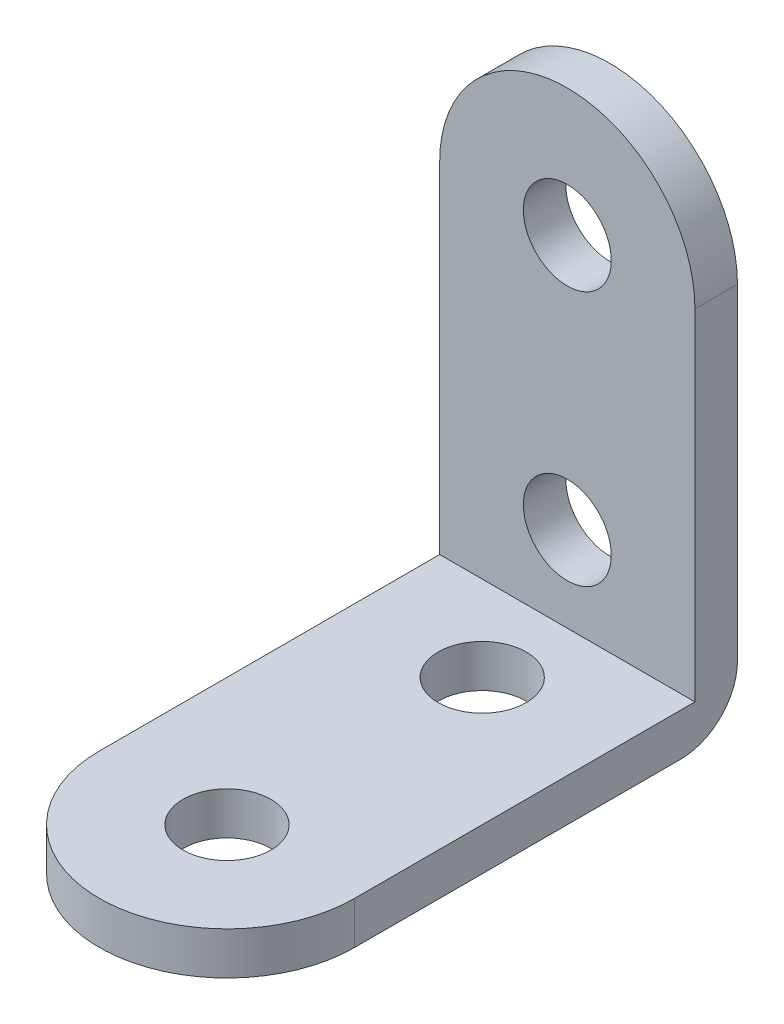
ISO-10303-21;
HEADER;
FILE_DESCRIPTION(('STEP AP214'),'2;1');
FILE_NAME('part.step','',(''),(''),'','','');
FILE_SCHEMA(('AUTOMOTIVE_DESIGN { 1 0 10303 214 1 1 1 1 }'));
ENDSEC;
DATA;
#1=APPLICATION_CONTEXT('core data for automotive mechanical design processes');
#2=APPLICATION_PROTOCOL_DEFINITION('international standard','automotive_design',2000,#1);
#3=PRODUCT_CONTEXT('',#1,'mechanical');
#4=PRODUCT('Part','Part','',(#3));
#5=PRODUCT_RELATED_PRODUCT_CATEGORY('part','',(#4));
#6=PRODUCT_DEFINITION_FORMATION('','',#4);
#7=PRODUCT_DEFINITION_CONTEXT('part definition',#1,'design');
#8=PRODUCT_DEFINITION('design','',#6,#7);
#9=PRODUCT_DEFINITION_SHAPE('','',#8);
#10=(LENGTH_UNIT() NAMED_UNIT(*) SI_UNIT(.MILLI.,.METRE.));
#11=(NAMED_UNIT(*) PLANE_ANGLE_UNIT() SI_UNIT($,.RADIAN.));
#12=(NAMED_UNIT(*) SI_UNIT($,.STERADIAN.) SOLID_ANGLE_UNIT());
#13=UNCERTAINTY_MEASURE_WITH_UNIT(LENGTH_MEASURE(1.E-05),#10,'distance_accuracy_value','');
#14=(GEOMETRIC_REPRESENTATION_CONTEXT(3) GLOBAL_UNCERTAINTY_ASSIGNED_CONTEXT((#13)) GLOBAL_UNIT_ASSIGNED_CONTEXT((#10,
#11,#12)) REPRESENTATION_CONTEXT('',''));
#15=CARTESIAN_POINT('',(0.,0.,0.));
#16=DIRECTION('',(0.,0.,1.));
#17=DIRECTION('',(1.,0.,0.));
#18=AXIS2_PLACEMENT_3D('',#15,#16,#17);
#19=CARTESIAN_POINT('',(0.,2.,-11.5));
#20=DIRECTION('',(-1.,0.,0.));
#21=DIRECTION('',(0.,0.,1.));
#22=AXIS2_PLACEMENT_3D('',#19,#20,#21);
#23=CYLINDRICAL_SURFACE('',#22,2.);
#24=DIRECTION('',(1.,0.,0.));
#25=VECTOR('',#24,1.);
#26=CARTESIAN_POINT('',(0.,0.,-11.5));
#27=LINE('',#26,#25);
#28=CARTESIAN_POINT('',(-4.5,0.,-11.5));
#29=VERTEX_POINT('',#28);
#30=CARTESIAN_POINT('',(4.5,0.,-11.5));
#31=VERTEX_POINT('',#30);
#32=EDGE_CURVE('E164',#29,#31,#27,.T.);
#33=ORIENTED_EDGE('',*,*,#32,.F.);
#34=CARTESIAN_POINT('',(-4.5,2.,-11.5));
#35=DIRECTION('',(-1.,0.,0.));
#36=DIRECTION('',(0.,0.,1.));
#37=AXIS2_PLACEMENT_3D('',#34,#35,#36);
#38=CIRCLE('',#37,2.);
#39=CARTESIAN_POINT('',(-4.5,2.,-13.5));
#40=VERTEX_POINT('',#39);
#41=EDGE_CURVE('E42',#40,#29,#38,.T.);
#42=ORIENTED_EDGE('',*,*,#41,.F.);
#43=DIRECTION('',(1.,0.,0.));
#44=VECTOR('',#43,1.);
#45=CARTESIAN_POINT('',(0.,2.,-13.5));
#46=LINE('',#45,#44);
#47=CARTESIAN_POINT('',(4.5,2.,-13.5));
#48=VERTEX_POINT('',#47);
#49=EDGE_CURVE('E167',#48,#40,#46,.F.);
#50=ORIENTED_EDGE('',*,*,#49,.F.);
#51=CARTESIAN_POINT('',(4.5,2.,-11.5));
#52=DIRECTION('',(-1.,0.,0.));
#53=DIRECTION('',(0.,0.,1.));
#54=AXIS2_PLACEMENT_3D('',#51,#52,#53);
#55=CIRCLE('',#54,2.);
#56=EDGE_CURVE('E11',#31,#48,#55,.F.);
#57=ORIENTED_EDGE('',*,*,#56,.F.);
#58=EDGE_LOOP('',(#33,#42,#50,#57));
#59=FACE_BOUND('',#58,.T.);
#60=ADVANCED_FACE('F35',(#59),#23,.T.);
#61=CARTESIAN_POINT('',(0.,1.5,-13.5));
#62=DIRECTION('',(0.,0.,-1.));
#63=DIRECTION('',(-1.,0.,0.));
#64=AXIS2_PLACEMENT_3D('',#61,#62,#63);
#65=PLANE('',#64);
#66=CARTESIAN_POINT('',(0.,13.5,-13.5));
#67=DIRECTION('',(0.,0.,-1.));
#68=DIRECTION('',(0.,1.,0.));
#69=AXIS2_PLACEMENT_3D('',#66,#67,#68);
#70=CIRCLE('',#69,1.55);
#71=CARTESIAN_POINT('',(0.,15.05,-13.5));
#72=VERTEX_POINT('',#71);
#73=EDGE_CURVE('E123',#72,#72,#70,.T.);
#74=ORIENTED_EDGE('',*,*,#73,.F.);
#75=EDGE_LOOP('',(#74));
#76=FACE_BOUND('',#75,.T.);
#77=DIRECTION('',(0.,-1.,0.));
#78=VECTOR('',#77,1.);
#79=CARTESIAN_POINT('',(4.5,1.5,-13.5));
#80=LINE('',#79,#78);
#81=CARTESIAN_POINT('',(4.5,13.5,-13.5));
#82=VERTEX_POINT('',#81);
#83=EDGE_CURVE('E96',#82,#48,#80,.T.);
#84=ORIENTED_EDGE('',*,*,#83,.T.);
#85=ORIENTED_EDGE('',*,*,#49,.T.);
#86=DIRECTION('',(0.,-1.,0.));
#87=VECTOR('',#86,1.);
#88=CARTESIAN_POINT('',(-4.5,1.5,-13.5));
#89=LINE('',#88,#87);
#90=CARTESIAN_POINT('',(-4.5,13.5,-13.5));
#91=VERTEX_POINT('',#90);
#92=EDGE_CURVE('E147',#91,#40,#89,.T.);
#93=ORIENTED_EDGE('',*,*,#92,.F.);
#94=CARTESIAN_POINT('',(0.,13.5,-13.5));
#95=DIRECTION('',(0.,0.,-1.));
#96=DIRECTION('',(0.,1.,0.));
#97=AXIS2_PLACEMENT_3D('',#94,#95,#96);
#98=CIRCLE('',#97,4.5);
#99=EDGE_CURVE('E121',#91,#82,#98,.T.);
#100=ORIENTED_EDGE('',*,*,#99,.T.);
#101=EDGE_LOOP('',(#84,#85,#93,#100));
#102=FACE_BOUND('',#101,.T.);
#103=CARTESIAN_POINT('',(0.,4.5,-13.5));
#104=DIRECTION('',(0.,0.,-1.));
#105=DIRECTION('',(0.,1.,0.));
#106=AXIS2_PLACEMENT_3D('',#103,#104,#105);
#107=CIRCLE('',#106,1.55);
#108=CARTESIAN_POINT('',(0.,6.05,-13.5));
#109=VERTEX_POINT('',#108);
#110=EDGE_CURVE('E124',#109,#109,#107,.T.);
#111=ORIENTED_EDGE('',*,*,#110,.F.);
#112=EDGE_LOOP('',(#111));
#113=FACE_BOUND('',#112,.T.);
#114=ADVANCED_FACE('F194',(#76,#102,#113),#65,.T.);
#115=CARTESIAN_POINT('',(0.,13.5,-12.));
#116=DIRECTION('',(0.,0.,1.));
#117=DIRECTION('',(0.,1.,0.));
#118=AXIS2_PLACEMENT_3D('',#115,#116,#117);
#119=PLANE('',#118);
#120=CARTESIAN_POINT('',(0.,13.5,-12.));
#121=DIRECTION('',(0.,0.,-1.));
#122=DIRECTION('',(0.,1.,0.));
#123=AXIS2_PLACEMENT_3D('',#120,#121,#122);
#124=CIRCLE('',#123,1.55);
#125=CARTESIAN_POINT('',(0.,15.05,-12.));
#126=VERTEX_POINT('',#125);
#127=EDGE_CURVE('E115',#126,#126,#124,.T.);
#128=ORIENTED_EDGE('',*,*,#127,.T.);
#129=EDGE_LOOP('',(#128));
#130=FACE_BOUND('',#129,.T.);
#131=DIRECTION('',(0.,-1.,0.));
#132=VECTOR('',#131,1.);
#133=CARTESIAN_POINT('',(-4.5,13.5,-12.));
#134=LINE('',#133,#132);
#135=CARTESIAN_POINT('',(-4.5,13.5,-12.));
#136=VERTEX_POINT('',#135);
#137=CARTESIAN_POINT('',(-4.5,1.5,-12.));
#138=VERTEX_POINT('',#137);
#139=EDGE_CURVE('E110',#136,#138,#134,.T.);
#140=ORIENTED_EDGE('',*,*,#139,.T.);
#141=DIRECTION('',(1.,0.,0.));
#142=VECTOR('',#141,1.);
#143=CARTESIAN_POINT('',(0.,1.5,-12.));
#144=LINE('',#143,#142);
#145=CARTESIAN_POINT('',(4.5,1.5,-12.));
#146=VERTEX_POINT('',#145);
#147=EDGE_CURVE('E101',#138,#146,#144,.T.);
#148=ORIENTED_EDGE('',*,*,#147,.T.);
#149=DIRECTION('',(0.,-1.,0.));
#150=VECTOR('',#149,1.);
#151=CARTESIAN_POINT('',(4.5,13.5,-12.));
#152=LINE('',#151,#150);
#153=CARTESIAN_POINT('',(4.5,13.5,-12.));
#154=VERTEX_POINT('',#153);
#155=EDGE_CURVE('E93',#154,#146,#152,.T.);
#156=ORIENTED_EDGE('',*,*,#155,.F.);
#157=CARTESIAN_POINT('',(0.,13.5,-12.));
#158=DIRECTION('',(0.,0.,-1.));
#159=DIRECTION('',(0.,1.,0.));
#160=AXIS2_PLACEMENT_3D('',#157,#158,#159);
#161=CIRCLE('',#160,4.5);
#162=EDGE_CURVE('E108',#136,#154,#161,.T.);
#163=ORIENTED_EDGE('',*,*,#162,.F.);
#164=EDGE_LOOP('',(#140,#148,#156,#163));
#165=FACE_BOUND('',#164,.T.);
#166=CARTESIAN_POINT('',(0.,4.5,-12.));
#167=DIRECTION('',(0.,0.,-1.));
#168=DIRECTION('',(0.,1.,0.));
#169=AXIS2_PLACEMENT_3D('',#166,#167,#168);
#170=CIRCLE('',#169,1.55);
#171=CARTESIAN_POINT('',(0.,6.05,-12.));
#172=VERTEX_POINT('',#171);
#173=EDGE_CURVE('E185',#172,#172,#170,.T.);
#174=ORIENTED_EDGE('',*,*,#173,.T.);
#175=EDGE_LOOP('',(#174));
#176=FACE_BOUND('',#175,.T.);
#177=ADVANCED_FACE('F106',(#130,#165,#176),#119,.T.);
#178=CARTESIAN_POINT('',(-4.5,1.5,0.));
#179=DIRECTION('',(-1.,0.,0.));
#180=DIRECTION('',(0.,0.,1.));
#181=AXIS2_PLACEMENT_3D('',#178,#179,#180);
#182=PLANE('',#181);
#183=ORIENTED_EDGE('',*,*,#92,.T.);
#184=ORIENTED_EDGE('',*,*,#41,.T.);
#185=DIRECTION('',(0.,0.,-1.));
#186=VECTOR('',#185,1.);
#187=CARTESIAN_POINT('',(-4.5,0.,0.));
#188=LINE('',#187,#186);
#189=CARTESIAN_POINT('',(-4.5,0.,0.));
#190=VERTEX_POINT('',#189);
#191=EDGE_CURVE('E133',#190,#29,#188,.T.);
#192=ORIENTED_EDGE('',*,*,#191,.F.);
#193=DIRECTION('',(0.,-1.,0.));
#194=VECTOR('',#193,1.);
#195=CARTESIAN_POINT('',(-4.5,1.5,0.));
#196=LINE('',#195,#194);
#197=CARTESIAN_POINT('',(-4.5,1.5,0.));
#198=VERTEX_POINT('',#197);
#199=EDGE_CURVE('E162',#198,#190,#196,.T.);
#200=ORIENTED_EDGE('',*,*,#199,.F.);
#201=DIRECTION('',(0.,0.,-1.));
#202=VECTOR('',#201,1.);
#203=CARTESIAN_POINT('',(-4.5,1.5,0.));
#204=LINE('',#203,#202);
#205=EDGE_CURVE('E136',#198,#138,#204,.T.);
#206=ORIENTED_EDGE('',*,*,#205,.T.);
#207=ORIENTED_EDGE('',*,*,#139,.F.);
#208=DIRECTION('',(0.,0.,-1.));
#209=VECTOR('',#208,1.);
#210=CARTESIAN_POINT('',(-4.5,13.5,-12.));
#211=LINE('',#210,#209);
#212=EDGE_CURVE('E102',#136,#91,#211,.T.);
#213=ORIENTED_EDGE('',*,*,#212,.T.);
#214=EDGE_LOOP('',(#183,#184,#192,#200,#206,#207,#213));
#215=FACE_BOUND('',#214,.T.);
#216=ADVANCED_FACE('F170',(#215),#182,.T.);
#217=CARTESIAN_POINT('',(0.,1.5,0.));
#218=DIRECTION('',(0.,-1.,0.));
#219=DIRECTION('',(0.,0.,-1.));
#220=AXIS2_PLACEMENT_3D('',#217,#218,#219);
#221=CYLINDRICAL_SURFACE('',#220,4.5);
#222=CARTESIAN_POINT('',(0.,0.,0.));
#223=DIRECTION('',(0.,1.,0.));
#224=DIRECTION('',(0.,0.,1.));
#225=AXIS2_PLACEMENT_3D('',#222,#223,#224);
#226=CIRCLE('',#225,4.5);
#227=CARTESIAN_POINT('',(4.5,0.,0.));
#228=VERTEX_POINT('',#227);
#229=EDGE_CURVE('E150',#190,#228,#226,.T.);
#230=ORIENTED_EDGE('',*,*,#229,.T.);
#231=DIRECTION('',(0.,-1.,0.));
#232=VECTOR('',#231,1.);
#233=CARTESIAN_POINT('',(4.5,1.5,0.));
#234=LINE('',#233,#232);
#235=CARTESIAN_POINT('',(4.5,1.5,0.));
#236=VERTEX_POINT('',#235);
#237=EDGE_CURVE('E159',#236,#228,#234,.T.);
#238=ORIENTED_EDGE('',*,*,#237,.F.);
#239=CARTESIAN_POINT('',(0.,1.5,0.));
#240=DIRECTION('',(0.,1.,0.));
#241=DIRECTION('',(0.,0.,1.));
#242=AXIS2_PLACEMENT_3D('',#239,#240,#241);
#243=CIRCLE('',#242,4.5);
#244=EDGE_CURVE('E139',#198,#236,#243,.T.);
#245=ORIENTED_EDGE('',*,*,#244,.F.);
#246=ORIENTED_EDGE('',*,*,#199,.T.);
#247=EDGE_LOOP('',(#230,#238,#245,#246));
#248=FACE_BOUND('',#247,.T.);
#249=ADVANCED_FACE('F178',(#248),#221,.T.);
#250=CARTESIAN_POINT('',(4.5,1.5,0.));
#251=DIRECTION('',(-1.,0.,0.));
#252=DIRECTION('',(0.,0.,1.));
#253=AXIS2_PLACEMENT_3D('',#250,#251,#252);
#254=PLANE('',#253);
#255=DIRECTION('',(0.,0.,-1.));
#256=VECTOR('',#255,1.);
#257=CARTESIAN_POINT('',(4.5,0.,0.));
#258=LINE('',#257,#256);
#259=EDGE_CURVE('E152',#228,#31,#258,.T.);
#260=ORIENTED_EDGE('',*,*,#259,.T.);
#261=ORIENTED_EDGE('',*,*,#56,.T.);
#262=ORIENTED_EDGE('',*,*,#83,.F.);
#263=DIRECTION('',(0.,0.,-1.));
#264=VECTOR('',#263,1.);
#265=CARTESIAN_POINT('',(4.5,13.5,-12.));
#266=LINE('',#265,#264);
#267=EDGE_CURVE('E89',#154,#82,#266,.T.);
#268=ORIENTED_EDGE('',*,*,#267,.F.);
#269=ORIENTED_EDGE('',*,*,#155,.T.);
#270=DIRECTION('',(0.,0.,-1.));
#271=VECTOR('',#270,1.);
#272=CARTESIAN_POINT('',(4.5,1.5,0.));
#273=LINE('',#272,#271);
#274=EDGE_CURVE('E142',#236,#146,#273,.T.);
#275=ORIENTED_EDGE('',*,*,#274,.F.);
#276=ORIENTED_EDGE('',*,*,#237,.T.);
#277=EDGE_LOOP('',(#260,#261,#262,#268,#269,#275,#276));
#278=FACE_BOUND('',#277,.T.);
#279=ADVANCED_FACE('F91',(#278),#254,.F.);
#280=CARTESIAN_POINT('',(0.,1.5,0.));
#281=DIRECTION('',(0.,-1.,0.));
#282=DIRECTION('',(0.,0.,-1.));
#283=AXIS2_PLACEMENT_3D('',#280,#281,#282);
#284=CYLINDRICAL_SURFACE('',#283,1.55);
#285=CARTESIAN_POINT('',(0.,1.5,0.));
#286=DIRECTION('',(0.,1.,0.));
#287=DIRECTION('',(0.,0.,1.));
#288=AXIS2_PLACEMENT_3D('',#285,#286,#287);
#289=CIRCLE('',#288,1.55);
#290=CARTESIAN_POINT('',(0.,1.5,1.55));
#291=VERTEX_POINT('',#290);
#292=EDGE_CURVE('E144',#291,#291,#289,.T.);
#293=ORIENTED_EDGE('',*,*,#292,.T.);
#294=EDGE_LOOP('',(#293));
#295=FACE_BOUND('',#294,.T.);
#296=CARTESIAN_POINT('',(0.,0.,0.));
#297=DIRECTION('',(0.,1.,0.));
#298=DIRECTION('',(0.,0.,1.));
#299=AXIS2_PLACEMENT_3D('',#296,#297,#298);
#300=CIRCLE('',#299,1.55);
#301=CARTESIAN_POINT('',(0.,0.,1.55));
#302=VERTEX_POINT('',#301);
#303=EDGE_CURVE('E140',#302,#302,#300,.T.);
#304=ORIENTED_EDGE('',*,*,#303,.F.);
#305=EDGE_LOOP('',(#304));
#306=FACE_BOUND('',#305,.T.);
#307=ADVANCED_FACE('F208',(#295,#306),#284,.F.);
#308=CARTESIAN_POINT('',(0.,1.5,0.));
#309=DIRECTION('',(0.,1.,0.));
#310=DIRECTION('',(0.,0.,1.));
#311=AXIS2_PLACEMENT_3D('',#308,#309,#310);
#312=PLANE('',#311);
#313=ORIENTED_EDGE('',*,*,#147,.F.);
#314=ORIENTED_EDGE('',*,*,#205,.F.);
#315=ORIENTED_EDGE('',*,*,#244,.T.);
#316=ORIENTED_EDGE('',*,*,#274,.T.);
#317=EDGE_LOOP('',(#313,#314,#315,#316));
#318=FACE_BOUND('',#317,.T.);
#319=CARTESIAN_POINT('',(0.,1.5,-9.));
#320=DIRECTION('',(0.,1.,0.));
#321=DIRECTION('',(0.,0.,1.));
#322=AXIS2_PLACEMENT_3D('',#319,#320,#321);
#323=CIRCLE('',#322,1.55);
#324=CARTESIAN_POINT('',(0.,1.5,-7.45));
#325=VERTEX_POINT('',#324);
#326=EDGE_CURVE('E129',#325,#325,#323,.T.);
#327=ORIENTED_EDGE('',*,*,#326,.F.);
#328=EDGE_LOOP('',(#327));
#329=FACE_BOUND('',#328,.T.);
#330=ORIENTED_EDGE('',*,*,#292,.F.);
#331=EDGE_LOOP('',(#330));
#332=FACE_BOUND('',#331,.T.);
#333=ADVANCED_FACE('F181',(#318,#329,#332),#312,.T.);
#334=CARTESIAN_POINT('',(0.,0.,0.));
#335=DIRECTION('',(0.,1.,0.));
#336=DIRECTION('',(0.,0.,1.));
#337=AXIS2_PLACEMENT_3D('',#334,#335,#336);
#338=PLANE('',#337);
#339=CARTESIAN_POINT('',(0.,0.,-9.));
#340=DIRECTION('',(0.,1.,0.));
#341=DIRECTION('',(0.,0.,1.));
#342=AXIS2_PLACEMENT_3D('',#339,#340,#341);
#343=CIRCLE('',#342,1.55);
#344=CARTESIAN_POINT('',(0.,0.,-7.45));
#345=VERTEX_POINT('',#344);
#346=EDGE_CURVE('E130',#345,#345,#343,.T.);
#347=ORIENTED_EDGE('',*,*,#346,.T.);
#348=EDGE_LOOP('',(#347));
#349=FACE_BOUND('',#348,.T.);
#350=ORIENTED_EDGE('',*,*,#191,.T.);
#351=ORIENTED_EDGE('',*,*,#32,.T.);
#352=ORIENTED_EDGE('',*,*,#259,.F.);
#353=ORIENTED_EDGE('',*,*,#229,.F.);
#354=EDGE_LOOP('',(#350,#351,#352,#353));
#355=FACE_BOUND('',#354,.T.);
#356=ORIENTED_EDGE('',*,*,#303,.T.);
#357=EDGE_LOOP('',(#356));
#358=FACE_BOUND('',#357,.T.);
#359=ADVANCED_FACE('F174',(#349,#355,#358),#338,.F.);
#360=CARTESIAN_POINT('',(0.,0.,-9.));
#361=DIRECTION('',(0.,1.,0.));
#362=DIRECTION('',(0.,0.,1.));
#363=AXIS2_PLACEMENT_3D('',#360,#361,#362);
#364=CYLINDRICAL_SURFACE('',#363,1.55);
#365=ORIENTED_EDGE('',*,*,#346,.F.);
#366=EDGE_LOOP('',(#365));
#367=FACE_BOUND('',#366,.T.);
#368=ORIENTED_EDGE('',*,*,#326,.T.);
#369=EDGE_LOOP('',(#368));
#370=FACE_BOUND('',#369,.T.);
#371=ADVANCED_FACE('F245',(#367,#370),#364,.F.);
#372=CARTESIAN_POINT('',(0.,13.5,-12.));
#373=DIRECTION('',(0.,0.,-1.));
#374=DIRECTION('',(0.,1.,0.));
#375=AXIS2_PLACEMENT_3D('',#372,#373,#374);
#376=CYLINDRICAL_SURFACE('',#375,4.5);
#377=ORIENTED_EDGE('',*,*,#99,.F.);
#378=ORIENTED_EDGE('',*,*,#212,.F.);
#379=ORIENTED_EDGE('',*,*,#162,.T.);
#380=ORIENTED_EDGE('',*,*,#267,.T.);
#381=EDGE_LOOP('',(#377,#378,#379,#380));
#382=FACE_BOUND('',#381,.T.);
#383=ADVANCED_FACE('F112',(#382),#376,.T.);
#384=CARTESIAN_POINT('',(0.,13.5,-12.));
#385=DIRECTION('',(0.,0.,-1.));
#386=DIRECTION('',(0.,1.,0.));
#387=AXIS2_PLACEMENT_3D('',#384,#385,#386);
#388=CYLINDRICAL_SURFACE('',#387,1.55);
#389=ORIENTED_EDGE('',*,*,#127,.F.);
#390=EDGE_LOOP('',(#389));
#391=FACE_BOUND('',#390,.T.);
#392=ORIENTED_EDGE('',*,*,#73,.T.);
#393=EDGE_LOOP('',(#392));
#394=FACE_BOUND('',#393,.T.);
#395=ADVANCED_FACE('F260',(#391,#394),#388,.F.);
#396=CARTESIAN_POINT('',(0.,4.5,-13.5));
#397=DIRECTION('',(0.,0.,1.));
#398=DIRECTION('',(0.,-1.,0.));
#399=AXIS2_PLACEMENT_3D('',#396,#397,#398);
#400=CYLINDRICAL_SURFACE('',#399,1.55);
#401=ORIENTED_EDGE('',*,*,#110,.T.);
#402=EDGE_LOOP('',(#401));
#403=FACE_BOUND('',#402,.T.);
#404=ORIENTED_EDGE('',*,*,#173,.F.);
#405=EDGE_LOOP('',(#404));
#406=FACE_BOUND('',#405,.T.);
#407=ADVANCED_FACE('F191',(#403,#406),#400,.F.);
#408=CLOSED_SHELL('',(#60,#114,#177,#216,#249,#279,#307,#333,#359,#371,#383,#395,#407));
#409=MANIFOLD_SOLID_BREP('B2',#408);
#410=ADVANCED_BREP_SHAPE_REPRESENTATION('',(#18,#409),#14);
#411=SHAPE_DEFINITION_REPRESENTATION(#9,#410);
ENDSEC;
END-ISO-10303-21;
